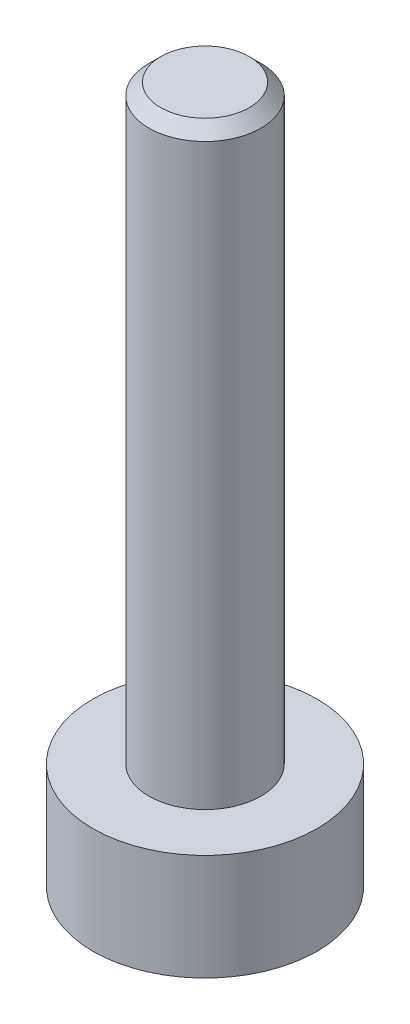
ISO-10303-21;
HEADER;
FILE_DESCRIPTION(('STEP AP214'),'2;1');
FILE_NAME('part.step','',(''),(''),'','','');
FILE_SCHEMA(('AUTOMOTIVE_DESIGN { 1 0 10303 214 1 1 1 1 }'));
ENDSEC;
DATA;
#1=APPLICATION_CONTEXT('core data for automotive mechanical design processes');
#2=APPLICATION_PROTOCOL_DEFINITION('international standard','automotive_design',2000,#1);
#3=PRODUCT_CONTEXT('',#1,'mechanical');
#4=PRODUCT('Part','Part','',(#3));
#5=PRODUCT_RELATED_PRODUCT_CATEGORY('part','',(#4));
#6=PRODUCT_DEFINITION_FORMATION('','',#4);
#7=PRODUCT_DEFINITION_CONTEXT('part definition',#1,'design');
#8=PRODUCT_DEFINITION('design','',#6,#7);
#9=PRODUCT_DEFINITION_SHAPE('','',#8);
#10=(LENGTH_UNIT() NAMED_UNIT(*) SI_UNIT(.MILLI.,.METRE.));
#11=(NAMED_UNIT(*) PLANE_ANGLE_UNIT() SI_UNIT($,.RADIAN.));
#12=(NAMED_UNIT(*) SI_UNIT($,.STERADIAN.) SOLID_ANGLE_UNIT());
#13=UNCERTAINTY_MEASURE_WITH_UNIT(LENGTH_MEASURE(1.E-05),#10,'distance_accuracy_value','');
#14=(GEOMETRIC_REPRESENTATION_CONTEXT(3) GLOBAL_UNCERTAINTY_ASSIGNED_CONTEXT((#13)) GLOBAL_UNIT_ASSIGNED_CONTEXT((#10,
#11,#12)) REPRESENTATION_CONTEXT('',''));
#15=CARTESIAN_POINT('',(0.,0.,0.));
#16=DIRECTION('',(0.,0.,1.));
#17=DIRECTION('',(1.,0.,0.));
#18=AXIS2_PLACEMENT_3D('',#15,#16,#17);
#19=CARTESIAN_POINT('',(0.75,10.,0.));
#20=DIRECTION('',(0.,-1.,0.));
#21=DIRECTION('',(1.,0.,0.));
#22=AXIS2_PLACEMENT_3D('',#19,#20,#21);
#23=PLANE('',#22);
#24=CARTESIAN_POINT('',(0.,10.,0.));
#25=DIRECTION('',(0.,1.,0.));
#26=DIRECTION('',(-1.,0.,0.));
#27=AXIS2_PLACEMENT_3D('',#24,#25,#26);
#28=CIRCLE('',#27,0.750000000000018);
#29=CARTESIAN_POINT('',(-0.750000000000035,10.,0.));
#30=VERTEX_POINT('',#29);
#31=EDGE_CURVE('E11',#30,#30,#28,.T.);
#32=ORIENTED_EDGE('',*,*,#31,.T.);
#33=EDGE_LOOP('',(#32));
#34=FACE_BOUND('',#33,.T.);
#35=ADVANCED_FACE('F37',(#34),#23,.F.);
#36=CARTESIAN_POINT('',(0.,10.,0.));
#37=DIRECTION('',(0.,-1.,0.));
#38=DIRECTION('',(1.,0.,0.));
#39=AXIS2_PLACEMENT_3D('',#36,#37,#38);
#40=CONICAL_SURFACE('',#39,0.750000000000018,0.78539816339745);
#41=CARTESIAN_POINT('',(0.,9.8,0.));
#42=DIRECTION('',(0.,1.,0.));
#43=DIRECTION('',(-1.,0.,0.));
#44=AXIS2_PLACEMENT_3D('',#41,#42,#43);
#45=CIRCLE('',#44,0.950000000000017);
#46=CARTESIAN_POINT('',(-0.950000000000035,9.8,0.));
#47=VERTEX_POINT('',#46);
#48=EDGE_CURVE('E44',#47,#47,#45,.T.);
#49=ORIENTED_EDGE('',*,*,#48,.T.);
#50=EDGE_LOOP('',(#49));
#51=FACE_BOUND('',#50,.T.);
#52=ORIENTED_EDGE('',*,*,#31,.F.);
#53=EDGE_LOOP('',(#52));
#54=FACE_BOUND('',#53,.T.);
#55=ADVANCED_FACE('F156',(#51,#54),#40,.T.);
#56=CARTESIAN_POINT('',(0.,-2.,0.));
#57=DIRECTION('',(0.,1.,0.));
#58=DIRECTION('',(-1.,0.,0.));
#59=AXIS2_PLACEMENT_3D('',#56,#57,#58);
#60=CYLINDRICAL_SURFACE('',#59,0.95000000000001);
#61=CARTESIAN_POINT('',(0.,0.,0.));
#62=DIRECTION('',(0.,1.,0.));
#63=DIRECTION('',(-1.,0.,0.));
#64=AXIS2_PLACEMENT_3D('',#61,#62,#63);
#65=CIRCLE('',#64,0.950000000000003);
#66=CARTESIAN_POINT('',(-0.950000000000008,0.,0.));
#67=VERTEX_POINT('',#66);
#68=EDGE_CURVE('E151',#67,#67,#65,.T.);
#69=ORIENTED_EDGE('',*,*,#68,.T.);
#70=EDGE_LOOP('',(#69));
#71=FACE_BOUND('',#70,.T.);
#72=ORIENTED_EDGE('',*,*,#48,.F.);
#73=EDGE_LOOP('',(#72));
#74=FACE_BOUND('',#73,.T.);
#75=ADVANCED_FACE('F159',(#71,#74),#60,.T.);
#76=CARTESIAN_POINT('',(0.949999999999998,0.,0.));
#77=DIRECTION('',(0.,1.,0.));
#78=DIRECTION('',(-1.,0.,0.));
#79=AXIS2_PLACEMENT_3D('',#76,#77,#78);
#80=PLANE('',#79);
#81=CARTESIAN_POINT('',(0.,0.,0.));
#82=DIRECTION('',(0.,1.,0.));
#83=DIRECTION('',(-1.,0.,0.));
#84=AXIS2_PLACEMENT_3D('',#81,#82,#83);
#85=CIRCLE('',#84,1.9);
#86=CARTESIAN_POINT('',(-1.90000000000001,0.,0.));
#87=VERTEX_POINT('',#86);
#88=EDGE_CURVE('E148',#87,#87,#85,.T.);
#89=ORIENTED_EDGE('',*,*,#88,.T.);
#90=EDGE_LOOP('',(#89));
#91=FACE_BOUND('',#90,.T.);
#92=ORIENTED_EDGE('',*,*,#68,.F.);
#93=EDGE_LOOP('',(#92));
#94=FACE_BOUND('',#93,.T.);
#95=ADVANCED_FACE('F161',(#91,#94),#80,.T.);
#96=CARTESIAN_POINT('',(0.,-2.,0.));
#97=DIRECTION('',(0.,1.,0.));
#98=DIRECTION('',(-1.,0.,0.));
#99=AXIS2_PLACEMENT_3D('',#96,#97,#98);
#100=CYLINDRICAL_SURFACE('',#99,1.9);
#101=ORIENTED_EDGE('',*,*,#88,.F.);
#102=EDGE_LOOP('',(#101));
#103=FACE_BOUND('',#102,.T.);
#104=CARTESIAN_POINT('',(0.,-1.8,0.));
#105=DIRECTION('',(0.,1.,0.));
#106=DIRECTION('',(-1.,0.,0.));
#107=AXIS2_PLACEMENT_3D('',#104,#105,#106);
#108=CIRCLE('',#107,1.9);
#109=CARTESIAN_POINT('',(-1.9,-1.8,0.));
#110=VERTEX_POINT('',#109);
#111=EDGE_CURVE('E145',#110,#110,#108,.T.);
#112=ORIENTED_EDGE('',*,*,#111,.T.);
#113=EDGE_LOOP('',(#112));
#114=FACE_BOUND('',#113,.T.);
#115=ADVANCED_FACE('F168',(#103,#114),#100,.T.);
#116=CARTESIAN_POINT('',(0.,-2.,0.));
#117=DIRECTION('',(0.,1.,0.));
#118=DIRECTION('',(-1.,0.,0.));
#119=AXIS2_PLACEMENT_3D('',#116,#117,#118);
#120=CONICAL_SURFACE('',#119,1.55358983848622,1.0471975511966);
#121=ORIENTED_EDGE('',*,*,#111,.F.);
#122=EDGE_LOOP('',(#121));
#123=FACE_BOUND('',#122,.T.);
#124=CARTESIAN_POINT('',(0.,-2.,0.));
#125=DIRECTION('',(0.,1.,0.));
#126=DIRECTION('',(-1.,0.,0.));
#127=AXIS2_PLACEMENT_3D('',#124,#125,#126);
#128=CIRCLE('',#127,1.55358983848622);
#129=CARTESIAN_POINT('',(-1.55358983848622,-2.,0.));
#130=VERTEX_POINT('',#129);
#131=EDGE_CURVE('E136',#130,#130,#128,.T.);
#132=ORIENTED_EDGE('',*,*,#131,.T.);
#133=EDGE_LOOP('',(#132));
#134=FACE_BOUND('',#133,.T.);
#135=ADVANCED_FACE('F202',(#123,#134),#120,.T.);
#136=CARTESIAN_POINT('',(1.55358983848622,-2.,0.));
#137=DIRECTION('',(0.,-1.,0.));
#138=DIRECTION('',(1.,0.,0.));
#139=AXIS2_PLACEMENT_3D('',#136,#137,#138);
#140=PLANE('',#139);
#141=DIRECTION('',(-0.5,0.,-0.866025403784439));
#142=VECTOR('',#141,1.);
#143=CARTESIAN_POINT('',(-0.433012701892217,-2.,0.75));
#144=LINE('',#143,#142);
#145=CARTESIAN_POINT('',(-0.433012701892217,-2.,0.75));
#146=VERTEX_POINT('',#145);
#147=CARTESIAN_POINT('',(-0.866025403784436,-2.,0.));
#148=VERTEX_POINT('',#147);
#149=EDGE_CURVE('E51',#146,#148,#144,.T.);
#150=ORIENTED_EDGE('',*,*,#149,.F.);
#151=DIRECTION('',(1.,0.,0.));
#152=VECTOR('',#151,1.);
#153=CARTESIAN_POINT('',(-0.433012701892217,-2.,0.75));
#154=LINE('',#153,#152);
#155=CARTESIAN_POINT('',(0.433012701892222,-2.,0.75));
#156=VERTEX_POINT('',#155);
#157=EDGE_CURVE('E120',#146,#156,#154,.T.);
#158=ORIENTED_EDGE('',*,*,#157,.T.);
#159=DIRECTION('',(0.5,0.,-0.866025403784439));
#160=VECTOR('',#159,1.);
#161=CARTESIAN_POINT('',(0.433012701892222,-2.,0.75));
#162=LINE('',#161,#160);
#163=CARTESIAN_POINT('',(0.866025403784441,-2.,0.));
#164=VERTEX_POINT('',#163);
#165=EDGE_CURVE('E115',#156,#164,#162,.T.);
#166=ORIENTED_EDGE('',*,*,#165,.T.);
#167=DIRECTION('',(-0.5,0.,-0.866025403784439));
#168=VECTOR('',#167,1.);
#169=CARTESIAN_POINT('',(0.866025403784441,-2.,0.));
#170=LINE('',#169,#168);
#171=CARTESIAN_POINT('',(0.433012701892222,-2.,-0.75));
#172=VERTEX_POINT('',#171);
#173=EDGE_CURVE('E113',#164,#172,#170,.T.);
#174=ORIENTED_EDGE('',*,*,#173,.T.);
#175=DIRECTION('',(-1.,0.,0.));
#176=VECTOR('',#175,1.);
#177=CARTESIAN_POINT('',(0.433012701892222,-2.,-0.75));
#178=LINE('',#177,#176);
#179=CARTESIAN_POINT('',(-0.433012701892217,-2.,-0.75));
#180=VERTEX_POINT('',#179);
#181=EDGE_CURVE('E94',#172,#180,#178,.T.);
#182=ORIENTED_EDGE('',*,*,#181,.T.);
#183=DIRECTION('',(0.5,0.,-0.866025403784439));
#184=VECTOR('',#183,1.);
#185=CARTESIAN_POINT('',(-0.866025403784436,-2.,0.));
#186=LINE('',#185,#184);
#187=EDGE_CURVE('E105',#148,#180,#186,.T.);
#188=ORIENTED_EDGE('',*,*,#187,.F.);
#189=EDGE_LOOP('',(#150,#158,#166,#174,#182,#188));
#190=FACE_BOUND('',#189,.T.);
#191=ORIENTED_EDGE('',*,*,#131,.F.);
#192=EDGE_LOOP('',(#191));
#193=FACE_BOUND('',#192,.T.);
#194=ADVANCED_FACE('F109',(#190,#193),#140,.T.);
#195=CARTESIAN_POINT('',(-0.433012701892218,-1.,0.75));
#196=DIRECTION('',(-0.866025403784439,0.,0.5));
#197=DIRECTION('',(0.5,0.,0.866025403784439));
#198=AXIS2_PLACEMENT_3D('',#195,#196,#197);
#199=PLANE('',#198);
#200=ORIENTED_EDGE('',*,*,#149,.T.);
#201=DIRECTION('',(0.,-1.,0.));
#202=VECTOR('',#201,1.);
#203=CARTESIAN_POINT('',(-0.866025403784437,-1.,0.));
#204=LINE('',#203,#202);
#205=CARTESIAN_POINT('',(-0.866025403784437,-1.,0.));
#206=VERTEX_POINT('',#205);
#207=EDGE_CURVE('E102',#206,#148,#204,.T.);
#208=ORIENTED_EDGE('',*,*,#207,.F.);
#209=DIRECTION('',(-0.5,0.,-0.866025403784439));
#210=VECTOR('',#209,1.);
#211=CARTESIAN_POINT('',(-0.433012701892218,-1.,0.75));
#212=LINE('',#211,#210);
#213=CARTESIAN_POINT('',(-0.433012701892218,-1.,0.75));
#214=VERTEX_POINT('',#213);
#215=EDGE_CURVE('E123',#214,#206,#212,.T.);
#216=ORIENTED_EDGE('',*,*,#215,.F.);
#217=DIRECTION('',(0.,-1.,0.));
#218=VECTOR('',#217,1.);
#219=CARTESIAN_POINT('',(-0.433012701892218,-1.,0.75));
#220=LINE('',#219,#218);
#221=EDGE_CURVE('E58',#214,#146,#220,.T.);
#222=ORIENTED_EDGE('',*,*,#221,.T.);
#223=EDGE_LOOP('',(#200,#208,#216,#222));
#224=FACE_BOUND('',#223,.T.);
#225=ADVANCED_FACE('F221',(#224),#199,.F.);
#226=CARTESIAN_POINT('',(-0.433012701892218,-1.,0.75));
#227=DIRECTION('',(0.,0.,-1.));
#228=DIRECTION('',(-1.,0.,0.));
#229=AXIS2_PLACEMENT_3D('',#226,#227,#228);
#230=PLANE('',#229);
#231=ORIENTED_EDGE('',*,*,#157,.F.);
#232=ORIENTED_EDGE('',*,*,#221,.F.);
#233=DIRECTION('',(1.,0.,0.));
#234=VECTOR('',#233,1.);
#235=CARTESIAN_POINT('',(-0.433012701892218,-1.,0.75));
#236=LINE('',#235,#234);
#237=CARTESIAN_POINT('',(0.433012701892221,-1.,0.75));
#238=VERTEX_POINT('',#237);
#239=EDGE_CURVE('E133',#214,#238,#236,.T.);
#240=ORIENTED_EDGE('',*,*,#239,.T.);
#241=DIRECTION('',(0.,-1.,0.));
#242=VECTOR('',#241,1.);
#243=CARTESIAN_POINT('',(0.433012701892221,-1.,0.75));
#244=LINE('',#243,#242);
#245=EDGE_CURVE('E137',#238,#156,#244,.T.);
#246=ORIENTED_EDGE('',*,*,#245,.T.);
#247=EDGE_LOOP('',(#231,#232,#240,#246));
#248=FACE_BOUND('',#247,.T.);
#249=ADVANCED_FACE('F230',(#248),#230,.T.);
#250=CARTESIAN_POINT('',(0.433012701892221,-1.,0.75));
#251=DIRECTION('',(-0.866025403784439,0.,-0.5));
#252=DIRECTION('',(-0.5,0.,0.866025403784439));
#253=AXIS2_PLACEMENT_3D('',#250,#251,#252);
#254=PLANE('',#253);
#255=ORIENTED_EDGE('',*,*,#165,.F.);
#256=ORIENTED_EDGE('',*,*,#245,.F.);
#257=DIRECTION('',(0.5,0.,-0.866025403784439));
#258=VECTOR('',#257,1.);
#259=CARTESIAN_POINT('',(0.433012701892221,-1.,0.75));
#260=LINE('',#259,#258);
#261=CARTESIAN_POINT('',(0.86602540378444,-1.,0.));
#262=VERTEX_POINT('',#261);
#263=EDGE_CURVE('E131',#238,#262,#260,.T.);
#264=ORIENTED_EDGE('',*,*,#263,.T.);
#265=DIRECTION('',(0.,-1.,0.));
#266=VECTOR('',#265,1.);
#267=CARTESIAN_POINT('',(0.86602540378444,-1.,0.));
#268=LINE('',#267,#266);
#269=EDGE_CURVE('E139',#262,#164,#268,.T.);
#270=ORIENTED_EDGE('',*,*,#269,.T.);
#271=EDGE_LOOP('',(#255,#256,#264,#270));
#272=FACE_BOUND('',#271,.T.);
#273=ADVANCED_FACE('F239',(#272),#254,.T.);
#274=CARTESIAN_POINT('',(0.86602540378444,-1.,0.));
#275=DIRECTION('',(-0.866025403784439,0.,0.5));
#276=DIRECTION('',(0.5,0.,0.866025403784439));
#277=AXIS2_PLACEMENT_3D('',#274,#275,#276);
#278=PLANE('',#277);
#279=ORIENTED_EDGE('',*,*,#173,.F.);
#280=ORIENTED_EDGE('',*,*,#269,.F.);
#281=DIRECTION('',(-0.5,0.,-0.866025403784439));
#282=VECTOR('',#281,1.);
#283=CARTESIAN_POINT('',(0.86602540378444,-1.,0.));
#284=LINE('',#283,#282);
#285=CARTESIAN_POINT('',(0.433012701892221,-1.,-0.75));
#286=VERTEX_POINT('',#285);
#287=EDGE_CURVE('E129',#262,#286,#284,.T.);
#288=ORIENTED_EDGE('',*,*,#287,.T.);
#289=DIRECTION('',(0.,-1.,0.));
#290=VECTOR('',#289,1.);
#291=CARTESIAN_POINT('',(0.433012701892221,-1.,-0.75));
#292=LINE('',#291,#290);
#293=EDGE_CURVE('E101',#286,#172,#292,.T.);
#294=ORIENTED_EDGE('',*,*,#293,.T.);
#295=EDGE_LOOP('',(#279,#280,#288,#294));
#296=FACE_BOUND('',#295,.T.);
#297=ADVANCED_FACE('F248',(#296),#278,.T.);
#298=CARTESIAN_POINT('',(0.433012701892221,-1.,-0.75));
#299=DIRECTION('',(0.,0.,1.));
#300=DIRECTION('',(1.,0.,0.));
#301=AXIS2_PLACEMENT_3D('',#298,#299,#300);
#302=PLANE('',#301);
#303=ORIENTED_EDGE('',*,*,#181,.F.);
#304=ORIENTED_EDGE('',*,*,#293,.F.);
#305=DIRECTION('',(-1.,0.,0.));
#306=VECTOR('',#305,1.);
#307=CARTESIAN_POINT('',(0.433012701892221,-1.,-0.75));
#308=LINE('',#307,#306);
#309=CARTESIAN_POINT('',(-0.433012701892218,-1.,-0.75));
#310=VERTEX_POINT('',#309);
#311=EDGE_CURVE('E97',#286,#310,#308,.T.);
#312=ORIENTED_EDGE('',*,*,#311,.T.);
#313=DIRECTION('',(0.,-1.,0.));
#314=VECTOR('',#313,1.);
#315=CARTESIAN_POINT('',(-0.433012701892218,-1.,-0.75));
#316=LINE('',#315,#314);
#317=EDGE_CURVE('E89',#310,#180,#316,.T.);
#318=ORIENTED_EDGE('',*,*,#317,.T.);
#319=EDGE_LOOP('',(#303,#304,#312,#318));
#320=FACE_BOUND('',#319,.T.);
#321=ADVANCED_FACE('F91',(#320),#302,.T.);
#322=CARTESIAN_POINT('',(-0.866025403784437,-1.,0.));
#323=DIRECTION('',(-0.866025403784439,0.,-0.5));
#324=DIRECTION('',(-0.5,0.,0.866025403784439));
#325=AXIS2_PLACEMENT_3D('',#322,#323,#324);
#326=PLANE('',#325);
#327=ORIENTED_EDGE('',*,*,#187,.T.);
#328=ORIENTED_EDGE('',*,*,#317,.F.);
#329=DIRECTION('',(0.5,0.,-0.866025403784439));
#330=VECTOR('',#329,1.);
#331=CARTESIAN_POINT('',(-0.866025403784437,-1.,0.));
#332=LINE('',#331,#330);
#333=EDGE_CURVE('E126',#206,#310,#332,.T.);
#334=ORIENTED_EDGE('',*,*,#333,.F.);
#335=ORIENTED_EDGE('',*,*,#207,.T.);
#336=EDGE_LOOP('',(#327,#328,#334,#335));
#337=FACE_BOUND('',#336,.T.);
#338=ADVANCED_FACE('F106',(#337),#326,.F.);
#339=CARTESIAN_POINT('',(-1.29903810567666,-1.,-0.75));
#340=DIRECTION('',(0.,1.,0.));
#341=DIRECTION('',(-1.,0.,0.));
#342=AXIS2_PLACEMENT_3D('',#339,#340,#341);
#343=PLANE('',#342);
#344=ORIENTED_EDGE('',*,*,#215,.T.);
#345=ORIENTED_EDGE('',*,*,#333,.T.);
#346=ORIENTED_EDGE('',*,*,#311,.F.);
#347=ORIENTED_EDGE('',*,*,#287,.F.);
#348=ORIENTED_EDGE('',*,*,#263,.F.);
#349=ORIENTED_EDGE('',*,*,#239,.F.);
#350=EDGE_LOOP('',(#344,#345,#346,#347,#348,#349));
#351=FACE_BOUND('',#350,.T.);
#352=ADVANCED_FACE('F275',(#351),#343,.F.);
#353=CLOSED_SHELL('',(#35,#55,#75,#95,#115,#135,#194,#225,#249,#273,#297,#321,#338,#352));
#354=MANIFOLD_SOLID_BREP('B2',#353);
#355=ADVANCED_BREP_SHAPE_REPRESENTATION('',(#18,#354),#14);
#356=SHAPE_DEFINITION_REPRESENTATION(#9,#355);
ENDSEC;
END-ISO-10303-21;
